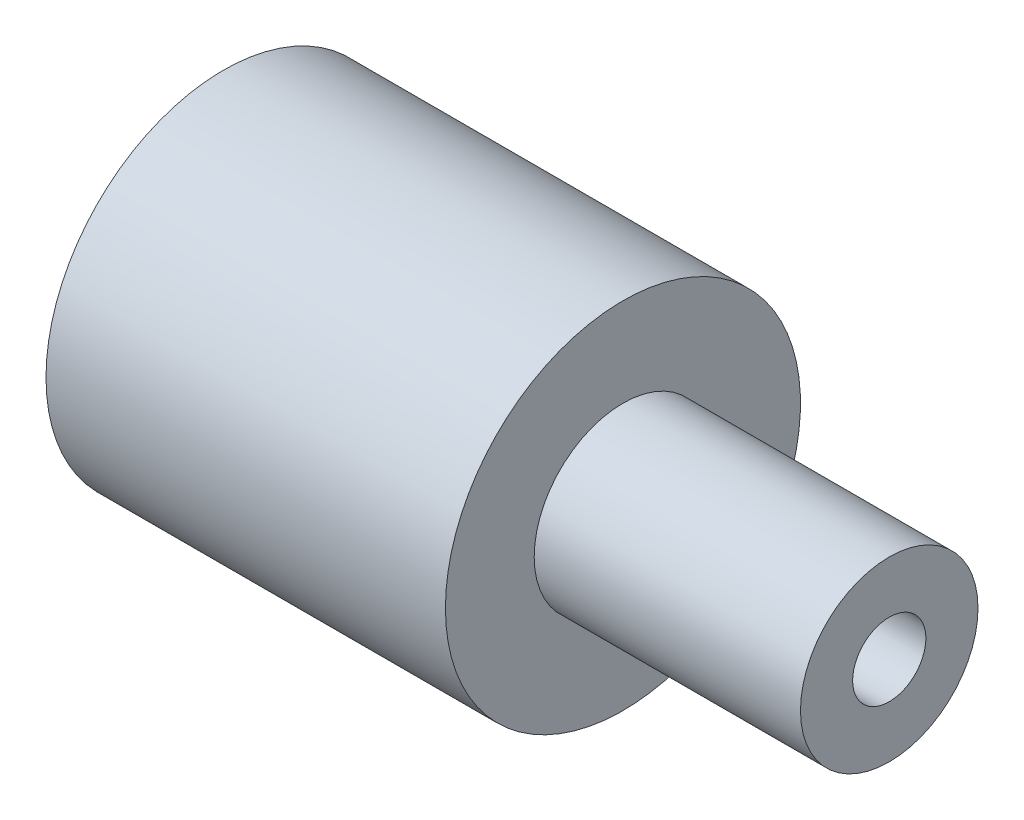
ISO-10303-21;
HEADER;
FILE_DESCRIPTION(('STEP AP214'),'2;1');
FILE_NAME('part.step','',(''),(''),'','','');
FILE_SCHEMA(('AUTOMOTIVE_DESIGN { 1 0 10303 214 1 1 1 1 }'));
ENDSEC;
DATA;
#1=APPLICATION_CONTEXT('core data for automotive mechanical design processes');
#2=APPLICATION_PROTOCOL_DEFINITION('international standard','automotive_design',2000,#1);
#3=PRODUCT_CONTEXT('',#1,'mechanical');
#4=PRODUCT('Part','Part','',(#3));
#5=PRODUCT_RELATED_PRODUCT_CATEGORY('part','',(#4));
#6=PRODUCT_DEFINITION_FORMATION('','',#4);
#7=PRODUCT_DEFINITION_CONTEXT('part definition',#1,'design');
#8=PRODUCT_DEFINITION('design','',#6,#7);
#9=PRODUCT_DEFINITION_SHAPE('','',#8);
#10=(LENGTH_UNIT() NAMED_UNIT(*) SI_UNIT(.MILLI.,.METRE.));
#11=(NAMED_UNIT(*) PLANE_ANGLE_UNIT() SI_UNIT($,.RADIAN.));
#12=(NAMED_UNIT(*) SI_UNIT($,.STERADIAN.) SOLID_ANGLE_UNIT());
#13=UNCERTAINTY_MEASURE_WITH_UNIT(LENGTH_MEASURE(1.E-05),#10,'distance_accuracy_value','');
#14=(GEOMETRIC_REPRESENTATION_CONTEXT(3) GLOBAL_UNCERTAINTY_ASSIGNED_CONTEXT((#13)) GLOBAL_UNIT_ASSIGNED_CONTEXT((#10,
#11,#12)) REPRESENTATION_CONTEXT('',''));
#15=CARTESIAN_POINT('',(0.,0.,0.));
#16=DIRECTION('',(0.,0.,1.));
#17=DIRECTION('',(1.,0.,0.));
#18=AXIS2_PLACEMENT_3D('',#15,#16,#17);
#19=CARTESIAN_POINT('',(0.,0.,0.));
#20=DIRECTION('',(1.,0.,0.));
#21=DIRECTION('',(0.,0.,-1.));
#22=AXIS2_PLACEMENT_3D('',#19,#20,#21);
#23=PLANE('',#22);
#24=CARTESIAN_POINT('',(0.,0.,0.));
#25=DIRECTION('',(-1.,0.,0.));
#26=DIRECTION('',(0.,0.,1.));
#27=AXIS2_PLACEMENT_3D('',#24,#25,#26);
#28=CIRCLE('',#27,1.64999999999999);
#29=CARTESIAN_POINT('',(0.,0.,1.64999999999999));
#30=VERTEX_POINT('',#29);
#31=EDGE_CURVE('E57',#30,#30,#28,.T.);
#32=ORIENTED_EDGE('',*,*,#31,.F.);
#33=EDGE_LOOP('',(#32));
#34=FACE_BOUND('',#33,.T.);
#35=CARTESIAN_POINT('',(0.,0.,0.));
#36=DIRECTION('',(-1.,0.,0.));
#37=DIRECTION('',(0.,0.,1.));
#38=AXIS2_PLACEMENT_3D('',#35,#36,#37);
#39=CIRCLE('',#38,8.);
#40=CARTESIAN_POINT('',(0.,0.,8.));
#41=VERTEX_POINT('',#40);
#42=EDGE_CURVE('E10',#41,#41,#39,.T.);
#43=ORIENTED_EDGE('',*,*,#42,.T.);
#44=EDGE_LOOP('',(#43));
#45=FACE_BOUND('',#44,.T.);
#46=ADVANCED_FACE('F35',(#34,#45),#23,.F.);
#47=CARTESIAN_POINT('',(0.,0.,0.));
#48=DIRECTION('',(-1.,0.,0.));
#49=DIRECTION('',(0.,0.,1.));
#50=AXIS2_PLACEMENT_3D('',#47,#48,#49);
#51=CYLINDRICAL_SURFACE('',#50,8.);
#52=ORIENTED_EDGE('',*,*,#42,.F.);
#53=EDGE_LOOP('',(#52));
#54=FACE_BOUND('',#53,.T.);
#55=CARTESIAN_POINT('',(18.,0.,0.));
#56=DIRECTION('',(-1.,0.,0.));
#57=DIRECTION('',(0.,0.,1.));
#58=AXIS2_PLACEMENT_3D('',#55,#56,#57);
#59=CIRCLE('',#58,8.);
#60=CARTESIAN_POINT('',(18.,0.,8.));
#61=VERTEX_POINT('',#60);
#62=EDGE_CURVE('E41',#61,#61,#59,.T.);
#63=ORIENTED_EDGE('',*,*,#62,.T.);
#64=EDGE_LOOP('',(#63));
#65=FACE_BOUND('',#64,.T.);
#66=ADVANCED_FACE('F64',(#54,#65),#51,.T.);
#67=CARTESIAN_POINT('',(18.,8.,0.));
#68=DIRECTION('',(-1.,0.,0.));
#69=DIRECTION('',(0.,0.,1.));
#70=AXIS2_PLACEMENT_3D('',#67,#68,#69);
#71=PLANE('',#70);
#72=ORIENTED_EDGE('',*,*,#62,.F.);
#73=EDGE_LOOP('',(#72));
#74=FACE_BOUND('',#73,.T.);
#75=CARTESIAN_POINT('',(18.,0.,0.));
#76=DIRECTION('',(-1.,0.,0.));
#77=DIRECTION('',(0.,0.,1.));
#78=AXIS2_PLACEMENT_3D('',#75,#76,#77);
#79=CIRCLE('',#78,4.);
#80=CARTESIAN_POINT('',(18.,0.,4.));
#81=VERTEX_POINT('',#80);
#82=EDGE_CURVE('E45',#81,#81,#79,.T.);
#83=ORIENTED_EDGE('',*,*,#82,.T.);
#84=EDGE_LOOP('',(#83));
#85=FACE_BOUND('',#84,.T.);
#86=ADVANCED_FACE('F68',(#74,#85),#71,.F.);
#87=CARTESIAN_POINT('',(0.,0.,0.));
#88=DIRECTION('',(-1.,0.,0.));
#89=DIRECTION('',(0.,0.,1.));
#90=AXIS2_PLACEMENT_3D('',#87,#88,#89);
#91=CYLINDRICAL_SURFACE('',#90,4.);
#92=ORIENTED_EDGE('',*,*,#82,.F.);
#93=EDGE_LOOP('',(#92));
#94=FACE_BOUND('',#93,.T.);
#95=CARTESIAN_POINT('',(30.,0.,0.));
#96=DIRECTION('',(-1.,0.,0.));
#97=DIRECTION('',(0.,0.,1.));
#98=AXIS2_PLACEMENT_3D('',#95,#96,#97);
#99=CIRCLE('',#98,4.);
#100=CARTESIAN_POINT('',(30.,0.,4.));
#101=VERTEX_POINT('',#100);
#102=EDGE_CURVE('E49',#101,#101,#99,.T.);
#103=ORIENTED_EDGE('',*,*,#102,.T.);
#104=EDGE_LOOP('',(#103));
#105=FACE_BOUND('',#104,.T.);
#106=ADVANCED_FACE('F73',(#94,#105),#91,.T.);
#107=CARTESIAN_POINT('',(30.,4.,0.));
#108=DIRECTION('',(-1.,0.,0.));
#109=DIRECTION('',(0.,0.,1.));
#110=AXIS2_PLACEMENT_3D('',#107,#108,#109);
#111=PLANE('',#110);
#112=CARTESIAN_POINT('',(30.,0.,0.));
#113=DIRECTION('',(-1.,0.,0.));
#114=DIRECTION('',(0.,0.,1.));
#115=AXIS2_PLACEMENT_3D('',#112,#113,#114);
#116=CIRCLE('',#115,1.65);
#117=CARTESIAN_POINT('',(30.,0.,1.65));
#118=VERTEX_POINT('',#117);
#119=EDGE_CURVE('E54',#118,#118,#116,.T.);
#120=ORIENTED_EDGE('',*,*,#119,.T.);
#121=EDGE_LOOP('',(#120));
#122=FACE_BOUND('',#121,.T.);
#123=ORIENTED_EDGE('',*,*,#102,.F.);
#124=EDGE_LOOP('',(#123));
#125=FACE_BOUND('',#124,.T.);
#126=ADVANCED_FACE('F79',(#122,#125),#111,.F.);
#127=CARTESIAN_POINT('',(0.,0.,0.));
#128=DIRECTION('',(-1.,0.,0.));
#129=DIRECTION('',(0.,0.,1.));
#130=AXIS2_PLACEMENT_3D('',#127,#128,#129);
#131=CYLINDRICAL_SURFACE('',#130,1.64999999999999);
#132=ORIENTED_EDGE('',*,*,#119,.F.);
#133=EDGE_LOOP('',(#132));
#134=FACE_BOUND('',#133,.T.);
#135=ORIENTED_EDGE('',*,*,#31,.T.);
#136=EDGE_LOOP('',(#135));
#137=FACE_BOUND('',#136,.T.);
#138=ADVANCED_FACE('F61',(#134,#137),#131,.F.);
#139=CLOSED_SHELL('',(#46,#66,#86,#106,#126,#138));
#140=MANIFOLD_SOLID_BREP('B2',#139);
#141=ADVANCED_BREP_SHAPE_REPRESENTATION('',(#18,#140),#14);
#142=SHAPE_DEFINITION_REPRESENTATION(#9,#141);
ENDSEC;
END-ISO-10303-21;
